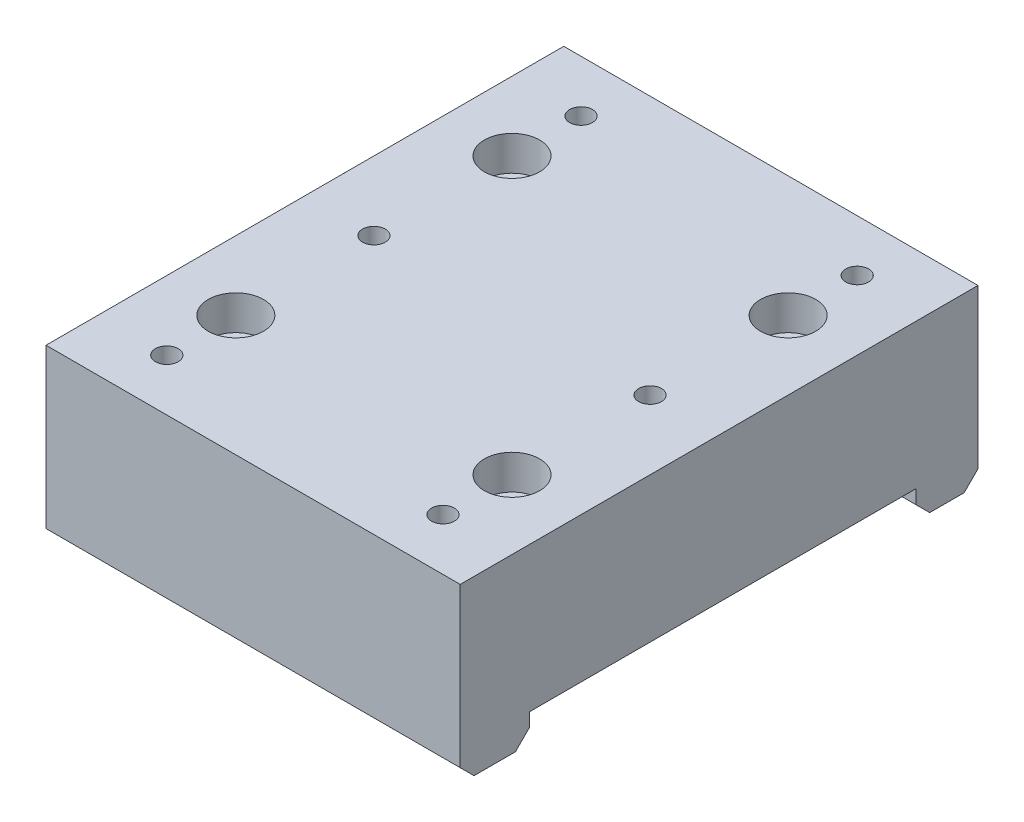
ISO-10303-21;
HEADER;
FILE_DESCRIPTION(('STEP AP214'),'2;1');
FILE_NAME('part.step','',(''),(''),'','','');
FILE_SCHEMA(('AUTOMOTIVE_DESIGN { 1 0 10303 214 1 1 1 1 }'));
ENDSEC;
DATA;
#1=APPLICATION_CONTEXT('core data for automotive mechanical design processes');
#2=APPLICATION_PROTOCOL_DEFINITION('international standard','automotive_design',2000,#1);
#3=PRODUCT_CONTEXT('',#1,'mechanical');
#4=PRODUCT('Part','Part','',(#3));
#5=PRODUCT_RELATED_PRODUCT_CATEGORY('part','',(#4));
#6=PRODUCT_DEFINITION_FORMATION('','',#4);
#7=PRODUCT_DEFINITION_CONTEXT('part definition',#1,'design');
#8=PRODUCT_DEFINITION('design','',#6,#7);
#9=PRODUCT_DEFINITION_SHAPE('','',#8);
#10=(LENGTH_UNIT() NAMED_UNIT(*) SI_UNIT(.MILLI.,.METRE.));
#11=(NAMED_UNIT(*) PLANE_ANGLE_UNIT() SI_UNIT($,.RADIAN.));
#12=(NAMED_UNIT(*) SI_UNIT($,.STERADIAN.) SOLID_ANGLE_UNIT());
#13=UNCERTAINTY_MEASURE_WITH_UNIT(LENGTH_MEASURE(1.E-05),#10,'distance_accuracy_value','');
#14=(GEOMETRIC_REPRESENTATION_CONTEXT(3) GLOBAL_UNCERTAINTY_ASSIGNED_CONTEXT((#13)) GLOBAL_UNIT_ASSIGNED_CONTEXT((#10,
#11,#12)) REPRESENTATION_CONTEXT('',''));
#15=CARTESIAN_POINT('',(0.,0.,0.));
#16=DIRECTION('',(0.,0.,1.));
#17=DIRECTION('',(1.,0.,0.));
#18=AXIS2_PLACEMENT_3D('',#15,#16,#17);
#19=CARTESIAN_POINT('',(0.,0.,0.));
#20=DIRECTION('',(0.,-1.,0.));
#21=DIRECTION('',(0.,0.,-1.));
#22=AXIS2_PLACEMENT_3D('',#19,#20,#21);
#23=PLANE('',#22);
#24=DIRECTION('',(0.,0.,-1.));
#25=VECTOR('',#24,1.);
#26=CARTESIAN_POINT('',(60.,0.,0.));
#27=LINE('',#26,#25);
#28=CARTESIAN_POINT('',(60.,0.,-2.00000000000003));
#29=VERTEX_POINT('',#28);
#30=CARTESIAN_POINT('',(60.,0.,-8.));
#31=VERTEX_POINT('',#30);
#32=EDGE_CURVE('E269',#29,#31,#27,.T.);
#33=ORIENTED_EDGE('',*,*,#32,.F.);
#34=DIRECTION('',(-1.,0.,0.));
#35=VECTOR('',#34,1.);
#36=CARTESIAN_POINT('',(0.,0.,-2.00000000000003));
#37=LINE('',#36,#35);
#38=CARTESIAN_POINT('',(0.,0.,-2.00000000000003));
#39=VERTEX_POINT('',#38);
#40=EDGE_CURVE('E62',#29,#39,#37,.T.);
#41=ORIENTED_EDGE('',*,*,#40,.T.);
#42=DIRECTION('',(0.,0.,1.));
#43=VECTOR('',#42,1.);
#44=CARTESIAN_POINT('',(0.,0.,0.));
#45=LINE('',#44,#43);
#46=CARTESIAN_POINT('',(0.,0.,-8.));
#47=VERTEX_POINT('',#46);
#48=EDGE_CURVE('E262',#47,#39,#45,.T.);
#49=ORIENTED_EDGE('',*,*,#48,.F.);
#50=DIRECTION('',(1.,0.,0.));
#51=VECTOR('',#50,1.);
#52=CARTESIAN_POINT('',(60.,0.,-8.));
#53=LINE('',#52,#51);
#54=EDGE_CURVE('E318',#47,#31,#53,.T.);
#55=ORIENTED_EDGE('',*,*,#54,.T.);
#56=EDGE_LOOP('',(#33,#41,#49,#55));
#57=FACE_BOUND('',#56,.T.);
#58=ADVANCED_FACE('F52',(#57),#23,.T.);
#59=CARTESIAN_POINT('',(0.,25.,0.));
#60=DIRECTION('',(1.,0.,0.));
#61=DIRECTION('',(0.,0.,-1.));
#62=AXIS2_PLACEMENT_3D('',#59,#60,#61);
#63=PLANE('',#62);
#64=DIRECTION('',(0.,-1.,0.));
#65=VECTOR('',#64,1.);
#66=CARTESIAN_POINT('',(0.,25.,-75.));
#67=LINE('',#66,#65);
#68=CARTESIAN_POINT('',(0.,25.,-75.));
#69=VERTEX_POINT('',#68);
#70=CARTESIAN_POINT('',(0.,2.00000000000002,-75.));
#71=VERTEX_POINT('',#70);
#72=EDGE_CURVE('E275',#69,#71,#67,.T.);
#73=ORIENTED_EDGE('',*,*,#72,.T.);
#74=DIRECTION('',(0.,-0.707106781186545,0.70710678118655));
#75=VECTOR('',#74,1.);
#76=CARTESIAN_POINT('',(0.,2.00000000000002,-75.));
#77=LINE('',#76,#75);
#78=CARTESIAN_POINT('',(0.,0.,-73.));
#79=VERTEX_POINT('',#78);
#80=EDGE_CURVE('E302',#71,#79,#77,.T.);
#81=ORIENTED_EDGE('',*,*,#80,.T.);
#82=CARTESIAN_POINT('',(0.,0.,-68.));
#83=VERTEX_POINT('',#82);
#84=EDGE_CURVE('E276',#79,#83,#45,.T.);
#85=ORIENTED_EDGE('',*,*,#84,.T.);
#86=DIRECTION('',(0.,0.707106781186545,0.70710678118655));
#87=VECTOR('',#86,1.);
#88=CARTESIAN_POINT('',(0.,2.00000000000002,-66.));
#89=LINE('',#88,#87);
#90=CARTESIAN_POINT('',(0.,2.00000000000002,-66.));
#91=VERTEX_POINT('',#90);
#92=EDGE_CURVE('E300',#83,#91,#89,.T.);
#93=ORIENTED_EDGE('',*,*,#92,.T.);
#94=DIRECTION('',(0.,1.,0.));
#95=VECTOR('',#94,1.);
#96=CARTESIAN_POINT('',(0.,0.,-66.));
#97=LINE('',#96,#95);
#98=CARTESIAN_POINT('',(0.,4.,-66.));
#99=VERTEX_POINT('',#98);
#100=EDGE_CURVE('E247',#91,#99,#97,.T.);
#101=ORIENTED_EDGE('',*,*,#100,.T.);
#102=DIRECTION('',(0.,0.,1.));
#103=VECTOR('',#102,1.);
#104=CARTESIAN_POINT('',(0.,4.,-10.));
#105=LINE('',#104,#103);
#106=CARTESIAN_POINT('',(0.,4.,-10.));
#107=VERTEX_POINT('',#106);
#108=EDGE_CURVE('E250',#99,#107,#105,.T.);
#109=ORIENTED_EDGE('',*,*,#108,.T.);
#110=DIRECTION('',(0.,-1.,0.));
#111=VECTOR('',#110,1.);
#112=CARTESIAN_POINT('',(0.,0.,-10.));
#113=LINE('',#112,#111);
#114=CARTESIAN_POINT('',(0.,2.00000000000002,-10.));
#115=VERTEX_POINT('',#114);
#116=EDGE_CURVE('E244',#107,#115,#113,.T.);
#117=ORIENTED_EDGE('',*,*,#116,.T.);
#118=DIRECTION('',(0.,-0.70710678118655,0.707106781186545));
#119=VECTOR('',#118,1.);
#120=CARTESIAN_POINT('',(0.,0.,-8.));
#121=LINE('',#120,#119);
#122=EDGE_CURVE('E296',#115,#47,#121,.T.);
#123=ORIENTED_EDGE('',*,*,#122,.T.);
#124=ORIENTED_EDGE('',*,*,#48,.T.);
#125=DIRECTION('',(0.,0.707106781186545,0.70710678118655));
#126=VECTOR('',#125,1.);
#127=CARTESIAN_POINT('',(0.,2.00000000000002,0.));
#128=LINE('',#127,#126);
#129=CARTESIAN_POINT('',(0.,2.00000000000002,0.));
#130=VERTEX_POINT('',#129);
#131=EDGE_CURVE('E298',#39,#130,#128,.T.);
#132=ORIENTED_EDGE('',*,*,#131,.T.);
#133=DIRECTION('',(0.,-1.,0.));
#134=VECTOR('',#133,1.);
#135=CARTESIAN_POINT('',(0.,25.,0.));
#136=LINE('',#135,#134);
#137=CARTESIAN_POINT('',(0.,25.,0.));
#138=VERTEX_POINT('',#137);
#139=EDGE_CURVE('E290',#138,#130,#136,.T.);
#140=ORIENTED_EDGE('',*,*,#139,.F.);
#141=DIRECTION('',(0.,0.,1.));
#142=VECTOR('',#141,1.);
#143=CARTESIAN_POINT('',(0.,25.,0.));
#144=LINE('',#143,#142);
#145=EDGE_CURVE('E265',#69,#138,#144,.T.);
#146=ORIENTED_EDGE('',*,*,#145,.F.);
#147=EDGE_LOOP('',(#73,#81,#85,#93,#101,#109,#117,#123,#124,#132,#140,#146));
#148=FACE_BOUND('',#147,.T.);
#149=ADVANCED_FACE('F354',(#148),#63,.F.);
#150=CARTESIAN_POINT('',(0.,25.,0.));
#151=DIRECTION('',(0.,0.,-1.));
#152=DIRECTION('',(-1.,0.,0.));
#153=AXIS2_PLACEMENT_3D('',#150,#151,#152);
#154=PLANE('',#153);
#155=ORIENTED_EDGE('',*,*,#139,.T.);
#156=DIRECTION('',(1.,0.,0.));
#157=VECTOR('',#156,1.);
#158=CARTESIAN_POINT('',(60.,2.00000000000002,0.));
#159=LINE('',#158,#157);
#160=CARTESIAN_POINT('',(60.,2.00000000000002,0.));
#161=VERTEX_POINT('',#160);
#162=EDGE_CURVE('E316',#130,#161,#159,.T.);
#163=ORIENTED_EDGE('',*,*,#162,.T.);
#164=DIRECTION('',(0.,-1.,0.));
#165=VECTOR('',#164,1.);
#166=CARTESIAN_POINT('',(60.,25.,0.));
#167=LINE('',#166,#165);
#168=CARTESIAN_POINT('',(60.,25.,0.));
#169=VERTEX_POINT('',#168);
#170=EDGE_CURVE('E287',#169,#161,#167,.T.);
#171=ORIENTED_EDGE('',*,*,#170,.F.);
#172=DIRECTION('',(1.,0.,0.));
#173=VECTOR('',#172,1.);
#174=CARTESIAN_POINT('',(0.,25.,0.));
#175=LINE('',#174,#173);
#176=EDGE_CURVE('E268',#138,#169,#175,.T.);
#177=ORIENTED_EDGE('',*,*,#176,.F.);
#178=EDGE_LOOP('',(#155,#163,#171,#177));
#179=FACE_BOUND('',#178,.T.);
#180=ADVANCED_FACE('F361',(#179),#154,.F.);
#181=CARTESIAN_POINT('',(60.,25.,0.));
#182=DIRECTION('',(-1.,0.,0.));
#183=DIRECTION('',(0.,0.,1.));
#184=AXIS2_PLACEMENT_3D('',#181,#182,#183);
#185=PLANE('',#184);
#186=CARTESIAN_POINT('',(60.,0.,-68.));
#187=VERTEX_POINT('',#186);
#188=CARTESIAN_POINT('',(60.,0.,-73.));
#189=VERTEX_POINT('',#188);
#190=EDGE_CURVE('E279',#187,#189,#27,.T.);
#191=ORIENTED_EDGE('',*,*,#190,.T.);
#192=DIRECTION('',(0.,0.707106781186545,-0.70710678118655));
#193=VECTOR('',#192,1.);
#194=CARTESIAN_POINT('',(60.,2.00000000000002,-75.));
#195=LINE('',#194,#193);
#196=CARTESIAN_POINT('',(60.,2.00000000000002,-75.));
#197=VERTEX_POINT('',#196);
#198=EDGE_CURVE('E312',#189,#197,#195,.T.);
#199=ORIENTED_EDGE('',*,*,#198,.T.);
#200=DIRECTION('',(0.,-1.,0.));
#201=VECTOR('',#200,1.);
#202=CARTESIAN_POINT('',(60.,25.,-75.));
#203=LINE('',#202,#201);
#204=CARTESIAN_POINT('',(60.,25.,-75.));
#205=VERTEX_POINT('',#204);
#206=EDGE_CURVE('E284',#205,#197,#203,.T.);
#207=ORIENTED_EDGE('',*,*,#206,.F.);
#208=DIRECTION('',(0.,0.,-1.));
#209=VECTOR('',#208,1.);
#210=CARTESIAN_POINT('',(60.,25.,0.));
#211=LINE('',#210,#209);
#212=EDGE_CURVE('E271',#169,#205,#211,.T.);
#213=ORIENTED_EDGE('',*,*,#212,.F.);
#214=ORIENTED_EDGE('',*,*,#170,.T.);
#215=DIRECTION('',(0.,-0.707106781186545,-0.70710678118655));
#216=VECTOR('',#215,1.);
#217=CARTESIAN_POINT('',(60.,2.00000000000002,0.));
#218=LINE('',#217,#216);
#219=EDGE_CURVE('E70',#161,#29,#218,.T.);
#220=ORIENTED_EDGE('',*,*,#219,.T.);
#221=ORIENTED_EDGE('',*,*,#32,.T.);
#222=DIRECTION('',(0.,0.70710678118655,-0.707106781186545));
#223=VECTOR('',#222,1.);
#224=CARTESIAN_POINT('',(60.,0.,-8.));
#225=LINE('',#224,#223);
#226=CARTESIAN_POINT('',(60.,2.00000000000002,-10.));
#227=VERTEX_POINT('',#226);
#228=EDGE_CURVE('E308',#31,#227,#225,.T.);
#229=ORIENTED_EDGE('',*,*,#228,.T.);
#230=DIRECTION('',(0.,-1.,0.));
#231=VECTOR('',#230,1.);
#232=CARTESIAN_POINT('',(60.,0.,-10.));
#233=LINE('',#232,#231);
#234=CARTESIAN_POINT('',(60.,4.,-10.));
#235=VERTEX_POINT('',#234);
#236=EDGE_CURVE('E241',#235,#227,#233,.T.);
#237=ORIENTED_EDGE('',*,*,#236,.F.);
#238=DIRECTION('',(0.,0.,1.));
#239=VECTOR('',#238,1.);
#240=CARTESIAN_POINT('',(60.,4.,-10.));
#241=LINE('',#240,#239);
#242=CARTESIAN_POINT('',(60.,4.,-66.));
#243=VERTEX_POINT('',#242);
#244=EDGE_CURVE('E248',#243,#235,#241,.T.);
#245=ORIENTED_EDGE('',*,*,#244,.F.);
#246=DIRECTION('',(0.,1.,0.));
#247=VECTOR('',#246,1.);
#248=CARTESIAN_POINT('',(60.,0.,-66.));
#249=LINE('',#248,#247);
#250=CARTESIAN_POINT('',(60.,2.00000000000002,-66.));
#251=VERTEX_POINT('',#250);
#252=EDGE_CURVE('E256',#251,#243,#249,.T.);
#253=ORIENTED_EDGE('',*,*,#252,.F.);
#254=DIRECTION('',(0.,-0.707106781186545,-0.70710678118655));
#255=VECTOR('',#254,1.);
#256=CARTESIAN_POINT('',(60.,2.00000000000002,-66.));
#257=LINE('',#256,#255);
#258=EDGE_CURVE('E78',#251,#187,#257,.T.);
#259=ORIENTED_EDGE('',*,*,#258,.T.);
#260=EDGE_LOOP('',(#191,#199,#207,#213,#214,#220,#221,#229,#237,#245,#253,#259));
#261=FACE_BOUND('',#260,.T.);
#262=ADVANCED_FACE('F391',(#261),#185,.F.);
#263=CARTESIAN_POINT('',(0.,25.,-75.));
#264=DIRECTION('',(0.,0.,1.));
#265=DIRECTION('',(1.,0.,0.));
#266=AXIS2_PLACEMENT_3D('',#263,#264,#265);
#267=PLANE('',#266);
#268=ORIENTED_EDGE('',*,*,#206,.T.);
#269=DIRECTION('',(-1.,0.,0.));
#270=VECTOR('',#269,1.);
#271=CARTESIAN_POINT('',(0.,2.00000000000002,-75.));
#272=LINE('',#271,#270);
#273=EDGE_CURVE('E293',#197,#71,#272,.T.);
#274=ORIENTED_EDGE('',*,*,#273,.T.);
#275=ORIENTED_EDGE('',*,*,#72,.F.);
#276=DIRECTION('',(-1.,0.,0.));
#277=VECTOR('',#276,1.);
#278=CARTESIAN_POINT('',(0.,25.,-75.));
#279=LINE('',#278,#277);
#280=EDGE_CURVE('E273',#205,#69,#279,.T.);
#281=ORIENTED_EDGE('',*,*,#280,.F.);
#282=EDGE_LOOP('',(#268,#274,#275,#281));
#283=FACE_BOUND('',#282,.T.);
#284=ADVANCED_FACE('F378',(#283),#267,.F.);
#285=CARTESIAN_POINT('',(0.,25.,0.));
#286=DIRECTION('',(0.,-1.,0.));
#287=DIRECTION('',(0.,0.,-1.));
#288=AXIS2_PLACEMENT_3D('',#285,#286,#287);
#289=PLANE('',#288);
#290=CARTESIAN_POINT('',(10.,25.,-67.5));
#291=DIRECTION('',(0.,1.,0.));
#292=DIRECTION('',(0.,0.,1.));
#293=AXIS2_PLACEMENT_3D('',#290,#291,#292);
#294=CIRCLE('',#293,1.65);
#295=CARTESIAN_POINT('',(10.,25.,-65.85));
#296=VERTEX_POINT('',#295);
#297=EDGE_CURVE('E172',#296,#296,#294,.T.);
#298=ORIENTED_EDGE('',*,*,#297,.F.);
#299=EDGE_LOOP('',(#298));
#300=FACE_BOUND('',#299,.T.);
#301=CARTESIAN_POINT('',(10.,25.,-37.5));
#302=DIRECTION('',(0.,1.,0.));
#303=DIRECTION('',(0.,0.,1.));
#304=AXIS2_PLACEMENT_3D('',#301,#302,#303);
#305=CIRCLE('',#304,1.65);
#306=CARTESIAN_POINT('',(10.,25.,-35.85));
#307=VERTEX_POINT('',#306);
#308=EDGE_CURVE('E171',#307,#307,#305,.T.);
#309=ORIENTED_EDGE('',*,*,#308,.F.);
#310=EDGE_LOOP('',(#309));
#311=FACE_BOUND('',#310,.T.);
#312=CARTESIAN_POINT('',(10.,25.,-7.5));
#313=DIRECTION('',(0.,1.,0.));
#314=DIRECTION('',(0.,0.,1.));
#315=AXIS2_PLACEMENT_3D('',#312,#313,#314);
#316=CIRCLE('',#315,1.65);
#317=CARTESIAN_POINT('',(10.,25.,-5.85));
#318=VERTEX_POINT('',#317);
#319=EDGE_CURVE('E182',#318,#318,#316,.T.);
#320=ORIENTED_EDGE('',*,*,#319,.F.);
#321=EDGE_LOOP('',(#320));
#322=FACE_BOUND('',#321,.T.);
#323=CARTESIAN_POINT('',(50.,25.,-67.5));
#324=DIRECTION('',(0.,1.,0.));
#325=DIRECTION('',(0.,0.,1.));
#326=AXIS2_PLACEMENT_3D('',#323,#324,#325);
#327=CIRCLE('',#326,1.65);
#328=CARTESIAN_POINT('',(50.,25.,-65.85));
#329=VERTEX_POINT('',#328);
#330=EDGE_CURVE('E188',#329,#329,#327,.T.);
#331=ORIENTED_EDGE('',*,*,#330,.F.);
#332=EDGE_LOOP('',(#331));
#333=FACE_BOUND('',#332,.T.);
#334=CARTESIAN_POINT('',(50.,25.,-37.5));
#335=DIRECTION('',(0.,1.,0.));
#336=DIRECTION('',(0.,0.,1.));
#337=AXIS2_PLACEMENT_3D('',#334,#335,#336);
#338=CIRCLE('',#337,1.65);
#339=CARTESIAN_POINT('',(50.,25.,-35.85));
#340=VERTEX_POINT('',#339);
#341=EDGE_CURVE('E194',#340,#340,#338,.T.);
#342=ORIENTED_EDGE('',*,*,#341,.F.);
#343=EDGE_LOOP('',(#342));
#344=FACE_BOUND('',#343,.T.);
#345=CARTESIAN_POINT('',(50.,25.,-7.5));
#346=DIRECTION('',(0.,1.,0.));
#347=DIRECTION('',(0.,0.,1.));
#348=AXIS2_PLACEMENT_3D('',#345,#346,#347);
#349=CIRCLE('',#348,1.65);
#350=CARTESIAN_POINT('',(50.,25.,-5.85));
#351=VERTEX_POINT('',#350);
#352=EDGE_CURVE('E200',#351,#351,#349,.T.);
#353=ORIENTED_EDGE('',*,*,#352,.F.);
#354=EDGE_LOOP('',(#353));
#355=FACE_BOUND('',#354,.T.);
#356=CARTESIAN_POINT('',(10.,25.,-17.5));
#357=DIRECTION('',(0.,1.,0.));
#358=DIRECTION('',(0.,0.,1.));
#359=AXIS2_PLACEMENT_3D('',#356,#357,#358);
#360=CIRCLE('',#359,4.);
#361=CARTESIAN_POINT('',(10.,25.,-13.5));
#362=VERTEX_POINT('',#361);
#363=EDGE_CURVE('E226',#362,#362,#360,.T.);
#364=ORIENTED_EDGE('',*,*,#363,.F.);
#365=EDGE_LOOP('',(#364));
#366=FACE_BOUND('',#365,.T.);
#367=CARTESIAN_POINT('',(50.,25.,-57.5));
#368=DIRECTION('',(0.,1.,0.));
#369=DIRECTION('',(0.,0.,1.));
#370=AXIS2_PLACEMENT_3D('',#367,#368,#369);
#371=CIRCLE('',#370,4.00000000000001);
#372=CARTESIAN_POINT('',(50.,25.,-53.5));
#373=VERTEX_POINT('',#372);
#374=EDGE_CURVE('E233',#373,#373,#371,.T.);
#375=ORIENTED_EDGE('',*,*,#374,.F.);
#376=EDGE_LOOP('',(#375));
#377=FACE_BOUND('',#376,.T.);
#378=CARTESIAN_POINT('',(50.,25.,-17.5));
#379=DIRECTION('',(0.,1.,0.));
#380=DIRECTION('',(0.,0.,1.));
#381=AXIS2_PLACEMENT_3D('',#378,#379,#380);
#382=CIRCLE('',#381,4.00000000000001);
#383=CARTESIAN_POINT('',(50.,25.,-13.5));
#384=VERTEX_POINT('',#383);
#385=EDGE_CURVE('E219',#384,#384,#382,.T.);
#386=ORIENTED_EDGE('',*,*,#385,.F.);
#387=EDGE_LOOP('',(#386));
#388=FACE_BOUND('',#387,.T.);
#389=CARTESIAN_POINT('',(10.,25.,-57.5));
#390=DIRECTION('',(0.,1.,0.));
#391=DIRECTION('',(0.,0.,1.));
#392=AXIS2_PLACEMENT_3D('',#389,#390,#391);
#393=CIRCLE('',#392,4.);
#394=CARTESIAN_POINT('',(10.,25.,-53.5));
#395=VERTEX_POINT('',#394);
#396=EDGE_CURVE('E229',#395,#395,#393,.T.);
#397=ORIENTED_EDGE('',*,*,#396,.F.);
#398=EDGE_LOOP('',(#397));
#399=FACE_BOUND('',#398,.T.);
#400=ORIENTED_EDGE('',*,*,#145,.T.);
#401=ORIENTED_EDGE('',*,*,#176,.T.);
#402=ORIENTED_EDGE('',*,*,#212,.T.);
#403=ORIENTED_EDGE('',*,*,#280,.T.);
#404=EDGE_LOOP('',(#400,#401,#402,#403));
#405=FACE_BOUND('',#404,.T.);
#406=ADVANCED_FACE('F369',(#300,#311,#322,#333,#344,#355,#366,#377,#388,#399,#405),#289,.F.);
#407=ORIENTED_EDGE('',*,*,#84,.F.);
#408=DIRECTION('',(1.,0.,0.));
#409=VECTOR('',#408,1.);
#410=CARTESIAN_POINT('',(60.,0.,-73.));
#411=LINE('',#410,#409);
#412=EDGE_CURVE('E306',#79,#189,#411,.T.);
#413=ORIENTED_EDGE('',*,*,#412,.T.);
#414=ORIENTED_EDGE('',*,*,#190,.F.);
#415=DIRECTION('',(-1.,0.,0.));
#416=VECTOR('',#415,1.);
#417=CARTESIAN_POINT('',(0.,0.,-68.));
#418=LINE('',#417,#416);
#419=EDGE_CURVE('E304',#187,#83,#418,.T.);
#420=ORIENTED_EDGE('',*,*,#419,.T.);
#421=EDGE_LOOP('',(#407,#413,#414,#420));
#422=FACE_BOUND('',#421,.T.);
#423=ADVANCED_FACE('F357',(#422),#23,.T.);
#424=CARTESIAN_POINT('',(0.,0.,-10.));
#425=DIRECTION('',(0.,0.,1.));
#426=DIRECTION('',(1.,0.,0.));
#427=AXIS2_PLACEMENT_3D('',#424,#425,#426);
#428=PLANE('',#427);
#429=ORIENTED_EDGE('',*,*,#236,.T.);
#430=DIRECTION('',(-1.,0.,0.));
#431=VECTOR('',#430,1.);
#432=CARTESIAN_POINT('',(0.,2.00000000000002,-10.));
#433=LINE('',#432,#431);
#434=EDGE_CURVE('E11',#227,#115,#433,.T.);
#435=ORIENTED_EDGE('',*,*,#434,.T.);
#436=ORIENTED_EDGE('',*,*,#116,.F.);
#437=DIRECTION('',(1.,0.,0.));
#438=VECTOR('',#437,1.);
#439=CARTESIAN_POINT('',(0.,4.,-10.));
#440=LINE('',#439,#438);
#441=EDGE_CURVE('E260',#107,#235,#440,.T.);
#442=ORIENTED_EDGE('',*,*,#441,.T.);
#443=EDGE_LOOP('',(#429,#435,#436,#442));
#444=FACE_BOUND('',#443,.T.);
#445=ADVANCED_FACE('F368',(#444),#428,.F.);
#446=CARTESIAN_POINT('',(0.,4.,-10.));
#447=DIRECTION('',(0.,1.,0.));
#448=DIRECTION('',(0.,0.,1.));
#449=AXIS2_PLACEMENT_3D('',#446,#447,#448);
#450=PLANE('',#449);
#451=CARTESIAN_POINT('',(10.,4.,-17.5));
#452=DIRECTION('',(0.,1.,0.));
#453=DIRECTION('',(0.,0.,1.));
#454=AXIS2_PLACEMENT_3D('',#451,#452,#453);
#455=CIRCLE('',#454,2.5);
#456=CARTESIAN_POINT('',(10.,4.,-15.));
#457=VERTEX_POINT('',#456);
#458=EDGE_CURVE('E57',#457,#457,#455,.T.);
#459=ORIENTED_EDGE('',*,*,#458,.T.);
#460=EDGE_LOOP('',(#459));
#461=FACE_BOUND('',#460,.T.);
#462=CARTESIAN_POINT('',(50.,4.,-17.5));
#463=DIRECTION('',(0.,1.,0.));
#464=DIRECTION('',(0.,0.,1.));
#465=AXIS2_PLACEMENT_3D('',#462,#463,#464);
#466=CIRCLE('',#465,2.5);
#467=CARTESIAN_POINT('',(50.,4.,-15.));
#468=VERTEX_POINT('',#467);
#469=EDGE_CURVE('E326',#468,#468,#466,.T.);
#470=ORIENTED_EDGE('',*,*,#469,.T.);
#471=EDGE_LOOP('',(#470));
#472=FACE_BOUND('',#471,.T.);
#473=CARTESIAN_POINT('',(50.,4.,-57.5));
#474=DIRECTION('',(0.,1.,0.));
#475=DIRECTION('',(0.,0.,1.));
#476=AXIS2_PLACEMENT_3D('',#473,#474,#475);
#477=CIRCLE('',#476,2.5);
#478=CARTESIAN_POINT('',(50.,4.,-55.));
#479=VERTEX_POINT('',#478);
#480=EDGE_CURVE('E324',#479,#479,#477,.T.);
#481=ORIENTED_EDGE('',*,*,#480,.T.);
#482=EDGE_LOOP('',(#481));
#483=FACE_BOUND('',#482,.T.);
#484=CARTESIAN_POINT('',(10.,4.,-57.5));
#485=DIRECTION('',(0.,1.,0.));
#486=DIRECTION('',(0.,0.,1.));
#487=AXIS2_PLACEMENT_3D('',#484,#485,#486);
#488=CIRCLE('',#487,2.5);
#489=CARTESIAN_POINT('',(10.,4.,-55.));
#490=VERTEX_POINT('',#489);
#491=EDGE_CURVE('E218',#490,#490,#488,.T.);
#492=ORIENTED_EDGE('',*,*,#491,.T.);
#493=EDGE_LOOP('',(#492));
#494=FACE_BOUND('',#493,.T.);
#495=ORIENTED_EDGE('',*,*,#244,.T.);
#496=ORIENTED_EDGE('',*,*,#441,.F.);
#497=ORIENTED_EDGE('',*,*,#108,.F.);
#498=DIRECTION('',(1.,0.,0.));
#499=VECTOR('',#498,1.);
#500=CARTESIAN_POINT('',(0.,4.,-66.));
#501=LINE('',#500,#499);
#502=EDGE_CURVE('E253',#99,#243,#501,.T.);
#503=ORIENTED_EDGE('',*,*,#502,.T.);
#504=EDGE_LOOP('',(#495,#496,#497,#503));
#505=FACE_BOUND('',#504,.T.);
#506=ADVANCED_FACE('F333',(#461,#472,#483,#494,#505),#450,.F.);
#507=CARTESIAN_POINT('',(0.,0.,-66.));
#508=DIRECTION('',(0.,0.,-1.));
#509=DIRECTION('',(-1.,0.,0.));
#510=AXIS2_PLACEMENT_3D('',#507,#508,#509);
#511=PLANE('',#510);
#512=ORIENTED_EDGE('',*,*,#100,.F.);
#513=DIRECTION('',(1.,0.,0.));
#514=VECTOR('',#513,1.);
#515=CARTESIAN_POINT('',(60.,2.00000000000002,-66.));
#516=LINE('',#515,#514);
#517=EDGE_CURVE('E314',#91,#251,#516,.T.);
#518=ORIENTED_EDGE('',*,*,#517,.T.);
#519=ORIENTED_EDGE('',*,*,#252,.T.);
#520=ORIENTED_EDGE('',*,*,#502,.F.);
#521=EDGE_LOOP('',(#512,#518,#519,#520));
#522=FACE_BOUND('',#521,.T.);
#523=ADVANCED_FACE('F418',(#522),#511,.F.);
#524=CARTESIAN_POINT('',(0.,2.00000000000002,-75.));
#525=DIRECTION('',(0.,-0.70710678118655,-0.707106781186545));
#526=DIRECTION('',(1.,0.,0.));
#527=AXIS2_PLACEMENT_3D('',#524,#525,#526);
#528=PLANE('',#527);
#529=ORIENTED_EDGE('',*,*,#198,.F.);
#530=ORIENTED_EDGE('',*,*,#412,.F.);
#531=ORIENTED_EDGE('',*,*,#80,.F.);
#532=ORIENTED_EDGE('',*,*,#273,.F.);
#533=EDGE_LOOP('',(#529,#530,#531,#532));
#534=FACE_BOUND('',#533,.T.);
#535=ADVANCED_FACE('F387',(#534),#528,.T.);
#536=CARTESIAN_POINT('',(0.,2.00000000000002,-66.));
#537=DIRECTION('',(0.,-0.70710678118655,0.707106781186545));
#538=DIRECTION('',(-1.,0.,0.));
#539=AXIS2_PLACEMENT_3D('',#536,#537,#538);
#540=PLANE('',#539);
#541=ORIENTED_EDGE('',*,*,#92,.F.);
#542=ORIENTED_EDGE('',*,*,#419,.F.);
#543=ORIENTED_EDGE('',*,*,#258,.F.);
#544=ORIENTED_EDGE('',*,*,#517,.F.);
#545=EDGE_LOOP('',(#541,#542,#543,#544));
#546=FACE_BOUND('',#545,.T.);
#547=ADVANCED_FACE('F419',(#546),#540,.T.);
#548=CARTESIAN_POINT('',(0.,2.00000000000002,0.));
#549=DIRECTION('',(0.,-0.70710678118655,0.707106781186545));
#550=DIRECTION('',(-1.,0.,0.));
#551=AXIS2_PLACEMENT_3D('',#548,#549,#550);
#552=PLANE('',#551);
#553=ORIENTED_EDGE('',*,*,#131,.F.);
#554=ORIENTED_EDGE('',*,*,#40,.F.);
#555=ORIENTED_EDGE('',*,*,#219,.F.);
#556=ORIENTED_EDGE('',*,*,#162,.F.);
#557=EDGE_LOOP('',(#553,#554,#555,#556));
#558=FACE_BOUND('',#557,.T.);
#559=ADVANCED_FACE('F402',(#558),#552,.T.);
#560=CARTESIAN_POINT('',(0.,0.,-8.));
#561=DIRECTION('',(0.,-0.707106781186545,-0.70710678118655));
#562=DIRECTION('',(-1.,0.,0.));
#563=AXIS2_PLACEMENT_3D('',#560,#561,#562);
#564=PLANE('',#563);
#565=ORIENTED_EDGE('',*,*,#122,.F.);
#566=ORIENTED_EDGE('',*,*,#434,.F.);
#567=ORIENTED_EDGE('',*,*,#228,.F.);
#568=ORIENTED_EDGE('',*,*,#54,.F.);
#569=EDGE_LOOP('',(#565,#566,#567,#568));
#570=FACE_BOUND('',#569,.T.);
#571=ADVANCED_FACE('F55',(#570),#564,.T.);
#572=CARTESIAN_POINT('',(10.,20.,-57.5));
#573=DIRECTION('',(0.,1.,0.));
#574=DIRECTION('',(0.,0.,1.));
#575=AXIS2_PLACEMENT_3D('',#572,#573,#574);
#576=CYLINDRICAL_SURFACE('',#575,4.);
#577=CARTESIAN_POINT('',(10.,20.,-57.5));
#578=DIRECTION('',(0.,1.,0.));
#579=DIRECTION('',(0.,0.,1.));
#580=AXIS2_PLACEMENT_3D('',#577,#578,#579);
#581=CIRCLE('',#580,4.);
#582=CARTESIAN_POINT('',(10.,20.,-53.5));
#583=VERTEX_POINT('',#582);
#584=EDGE_CURVE('E238',#583,#583,#581,.T.);
#585=ORIENTED_EDGE('',*,*,#584,.F.);
#586=EDGE_LOOP('',(#585));
#587=FACE_BOUND('',#586,.T.);
#588=ORIENTED_EDGE('',*,*,#396,.T.);
#589=EDGE_LOOP('',(#588));
#590=FACE_BOUND('',#589,.T.);
#591=ADVANCED_FACE('F518',(#587,#590),#576,.F.);
#592=CARTESIAN_POINT('',(10.,20.,-57.5));
#593=DIRECTION('',(0.,1.,0.));
#594=DIRECTION('',(0.,0.,1.));
#595=AXIS2_PLACEMENT_3D('',#592,#593,#594);
#596=PLANE('',#595);
#597=CARTESIAN_POINT('',(10.,20.,-57.5));
#598=DIRECTION('',(0.,1.,0.));
#599=DIRECTION('',(0.,0.,1.));
#600=AXIS2_PLACEMENT_3D('',#597,#598,#599);
#601=CIRCLE('',#600,2.5);
#602=CARTESIAN_POINT('',(10.,20.,-55.));
#603=VERTEX_POINT('',#602);
#604=EDGE_CURVE('E210',#603,#603,#601,.T.);
#605=ORIENTED_EDGE('',*,*,#604,.F.);
#606=EDGE_LOOP('',(#605));
#607=FACE_BOUND('',#606,.T.);
#608=ORIENTED_EDGE('',*,*,#584,.T.);
#609=EDGE_LOOP('',(#608));
#610=FACE_BOUND('',#609,.T.);
#611=ADVANCED_FACE('F525',(#607,#610),#596,.T.);
#612=CARTESIAN_POINT('',(50.,20.,-17.5));
#613=DIRECTION('',(0.,1.,0.));
#614=DIRECTION('',(0.,0.,1.));
#615=AXIS2_PLACEMENT_3D('',#612,#613,#614);
#616=CYLINDRICAL_SURFACE('',#615,4.00000000000001);
#617=CARTESIAN_POINT('',(50.,20.,-17.5));
#618=DIRECTION('',(0.,1.,0.));
#619=DIRECTION('',(0.,0.,1.));
#620=AXIS2_PLACEMENT_3D('',#617,#618,#619);
#621=CIRCLE('',#620,4.00000000000001);
#622=CARTESIAN_POINT('',(50.,20.,-13.5));
#623=VERTEX_POINT('',#622);
#624=EDGE_CURVE('E223',#623,#623,#621,.T.);
#625=ORIENTED_EDGE('',*,*,#624,.F.);
#626=EDGE_LOOP('',(#625));
#627=FACE_BOUND('',#626,.T.);
#628=ORIENTED_EDGE('',*,*,#385,.T.);
#629=EDGE_LOOP('',(#628));
#630=FACE_BOUND('',#629,.T.);
#631=ADVANCED_FACE('F534',(#627,#630),#616,.F.);
#632=CARTESIAN_POINT('',(50.,20.,-17.5));
#633=DIRECTION('',(0.,1.,0.));
#634=DIRECTION('',(0.,0.,1.));
#635=AXIS2_PLACEMENT_3D('',#632,#633,#634);
#636=PLANE('',#635);
#637=CARTESIAN_POINT('',(50.,20.,-17.5));
#638=DIRECTION('',(0.,1.,0.));
#639=DIRECTION('',(0.,0.,1.));
#640=AXIS2_PLACEMENT_3D('',#637,#638,#639);
#641=CIRCLE('',#640,2.5);
#642=CARTESIAN_POINT('',(50.,20.,-15.));
#643=VERTEX_POINT('',#642);
#644=EDGE_CURVE('E211',#643,#643,#641,.T.);
#645=ORIENTED_EDGE('',*,*,#644,.F.);
#646=EDGE_LOOP('',(#645));
#647=FACE_BOUND('',#646,.T.);
#648=ORIENTED_EDGE('',*,*,#624,.T.);
#649=EDGE_LOOP('',(#648));
#650=FACE_BOUND('',#649,.T.);
#651=ADVANCED_FACE('F543',(#647,#650),#636,.T.);
#652=CARTESIAN_POINT('',(50.,20.,-57.5));
#653=DIRECTION('',(0.,1.,0.));
#654=DIRECTION('',(0.,0.,1.));
#655=AXIS2_PLACEMENT_3D('',#652,#653,#654);
#656=CYLINDRICAL_SURFACE('',#655,4.00000000000001);
#657=CARTESIAN_POINT('',(50.,20.,-57.5));
#658=DIRECTION('',(0.,1.,0.));
#659=DIRECTION('',(0.,0.,1.));
#660=AXIS2_PLACEMENT_3D('',#657,#658,#659);
#661=CIRCLE('',#660,4.00000000000001);
#662=CARTESIAN_POINT('',(50.,20.,-53.5));
#663=VERTEX_POINT('',#662);
#664=EDGE_CURVE('E222',#663,#663,#661,.T.);
#665=ORIENTED_EDGE('',*,*,#664,.F.);
#666=EDGE_LOOP('',(#665));
#667=FACE_BOUND('',#666,.T.);
#668=ORIENTED_EDGE('',*,*,#374,.T.);
#669=EDGE_LOOP('',(#668));
#670=FACE_BOUND('',#669,.T.);
#671=ADVANCED_FACE('F552',(#667,#670),#656,.F.);
#672=CARTESIAN_POINT('',(50.,20.,-57.5));
#673=DIRECTION('',(0.,1.,0.));
#674=DIRECTION('',(0.,0.,1.));
#675=AXIS2_PLACEMENT_3D('',#672,#673,#674);
#676=PLANE('',#675);
#677=CARTESIAN_POINT('',(50.,20.,-57.5));
#678=DIRECTION('',(0.,1.,0.));
#679=DIRECTION('',(0.,0.,1.));
#680=AXIS2_PLACEMENT_3D('',#677,#678,#679);
#681=CIRCLE('',#680,2.5);
#682=CARTESIAN_POINT('',(50.,20.,-55.));
#683=VERTEX_POINT('',#682);
#684=EDGE_CURVE('E207',#683,#683,#681,.T.);
#685=ORIENTED_EDGE('',*,*,#684,.F.);
#686=EDGE_LOOP('',(#685));
#687=FACE_BOUND('',#686,.T.);
#688=ORIENTED_EDGE('',*,*,#664,.T.);
#689=EDGE_LOOP('',(#688));
#690=FACE_BOUND('',#689,.T.);
#691=ADVANCED_FACE('F561',(#687,#690),#676,.T.);
#692=CARTESIAN_POINT('',(10.,20.,-17.5));
#693=DIRECTION('',(0.,1.,0.));
#694=DIRECTION('',(0.,0.,1.));
#695=AXIS2_PLACEMENT_3D('',#692,#693,#694);
#696=CYLINDRICAL_SURFACE('',#695,4.);
#697=CARTESIAN_POINT('',(10.,20.,-17.5));
#698=DIRECTION('',(0.,1.,0.));
#699=DIRECTION('',(0.,0.,1.));
#700=AXIS2_PLACEMENT_3D('',#697,#698,#699);
#701=CIRCLE('',#700,4.);
#702=CARTESIAN_POINT('',(10.,20.,-13.5));
#703=VERTEX_POINT('',#702);
#704=EDGE_CURVE('E230',#703,#703,#701,.T.);
#705=ORIENTED_EDGE('',*,*,#704,.F.);
#706=EDGE_LOOP('',(#705));
#707=FACE_BOUND('',#706,.T.);
#708=ORIENTED_EDGE('',*,*,#363,.T.);
#709=EDGE_LOOP('',(#708));
#710=FACE_BOUND('',#709,.T.);
#711=ADVANCED_FACE('F570',(#707,#710),#696,.F.);
#712=CARTESIAN_POINT('',(10.,20.,-17.5));
#713=DIRECTION('',(0.,1.,0.));
#714=DIRECTION('',(0.,0.,1.));
#715=AXIS2_PLACEMENT_3D('',#712,#713,#714);
#716=PLANE('',#715);
#717=CARTESIAN_POINT('',(10.,20.,-17.5));
#718=DIRECTION('',(0.,1.,0.));
#719=DIRECTION('',(0.,0.,1.));
#720=AXIS2_PLACEMENT_3D('',#717,#718,#719);
#721=CIRCLE('',#720,2.5);
#722=CARTESIAN_POINT('',(10.,20.,-15.));
#723=VERTEX_POINT('',#722);
#724=EDGE_CURVE('E206',#723,#723,#721,.T.);
#725=ORIENTED_EDGE('',*,*,#724,.F.);
#726=EDGE_LOOP('',(#725));
#727=FACE_BOUND('',#726,.T.);
#728=ORIENTED_EDGE('',*,*,#704,.T.);
#729=EDGE_LOOP('',(#728));
#730=FACE_BOUND('',#729,.T.);
#731=ADVANCED_FACE('F579',(#727,#730),#716,.T.);
#732=CARTESIAN_POINT('',(10.,0.,-57.5));
#733=DIRECTION('',(0.,1.,0.));
#734=DIRECTION('',(0.,0.,1.));
#735=AXIS2_PLACEMENT_3D('',#732,#733,#734);
#736=CYLINDRICAL_SURFACE('',#735,2.5);
#737=ORIENTED_EDGE('',*,*,#604,.T.);
#738=EDGE_LOOP('',(#737));
#739=FACE_BOUND('',#738,.T.);
#740=ORIENTED_EDGE('',*,*,#491,.F.);
#741=EDGE_LOOP('',(#740));
#742=FACE_BOUND('',#741,.T.);
#743=ADVANCED_FACE('F588',(#739,#742),#736,.F.);
#744=CARTESIAN_POINT('',(50.,0.,-57.5));
#745=DIRECTION('',(0.,1.,0.));
#746=DIRECTION('',(0.,0.,1.));
#747=AXIS2_PLACEMENT_3D('',#744,#745,#746);
#748=CYLINDRICAL_SURFACE('',#747,2.5);
#749=ORIENTED_EDGE('',*,*,#684,.T.);
#750=EDGE_LOOP('',(#749));
#751=FACE_BOUND('',#750,.T.);
#752=ORIENTED_EDGE('',*,*,#480,.F.);
#753=EDGE_LOOP('',(#752));
#754=FACE_BOUND('',#753,.T.);
#755=ADVANCED_FACE('F349',(#751,#754),#748,.F.);
#756=CARTESIAN_POINT('',(50.,0.,-17.5));
#757=DIRECTION('',(0.,1.,0.));
#758=DIRECTION('',(0.,0.,1.));
#759=AXIS2_PLACEMENT_3D('',#756,#757,#758);
#760=CYLINDRICAL_SURFACE('',#759,2.5);
#761=ORIENTED_EDGE('',*,*,#644,.T.);
#762=EDGE_LOOP('',(#761));
#763=FACE_BOUND('',#762,.T.);
#764=ORIENTED_EDGE('',*,*,#469,.F.);
#765=EDGE_LOOP('',(#764));
#766=FACE_BOUND('',#765,.T.);
#767=ADVANCED_FACE('F338',(#763,#766),#760,.F.);
#768=CARTESIAN_POINT('',(10.,0.,-17.5));
#769=DIRECTION('',(0.,1.,0.));
#770=DIRECTION('',(0.,0.,1.));
#771=AXIS2_PLACEMENT_3D('',#768,#769,#770);
#772=CYLINDRICAL_SURFACE('',#771,2.5);
#773=ORIENTED_EDGE('',*,*,#724,.T.);
#774=EDGE_LOOP('',(#773));
#775=FACE_BOUND('',#774,.T.);
#776=ORIENTED_EDGE('',*,*,#458,.F.);
#777=EDGE_LOOP('',(#776));
#778=FACE_BOUND('',#777,.T.);
#779=ADVANCED_FACE('F335',(#775,#778),#772,.F.);
#780=CARTESIAN_POINT('',(50.,10.5,-7.5));
#781=DIRECTION('',(0.,1.,0.));
#782=DIRECTION('',(0.,0.,1.));
#783=AXIS2_PLACEMENT_3D('',#780,#781,#782);
#784=CONICAL_SURFACE('',#783,1.65,1.02974425867665);
#785=CARTESIAN_POINT('',(50.,9.50857997860453,-7.5));
#786=VERTEX_POINT('',#785);
#787=VERTEX_LOOP('',#786);
#788=FACE_BOUND('',#787,.T.);
#789=CARTESIAN_POINT('',(50.,10.5,-7.5));
#790=DIRECTION('',(0.,1.,0.));
#791=DIRECTION('',(0.,0.,1.));
#792=AXIS2_PLACEMENT_3D('',#789,#790,#791);
#793=CIRCLE('',#792,1.65);
#794=CARTESIAN_POINT('',(50.,10.5,-5.85));
#795=VERTEX_POINT('',#794);
#796=EDGE_CURVE('E203',#795,#795,#793,.T.);
#797=ORIENTED_EDGE('',*,*,#796,.T.);
#798=EDGE_LOOP('',(#797));
#799=FACE_BOUND('',#798,.T.);
#800=ADVANCED_FACE('F337',(#788,#799),#784,.F.);
#801=CARTESIAN_POINT('',(50.,25.,-7.5));
#802=DIRECTION('',(0.,1.,0.));
#803=DIRECTION('',(0.,0.,1.));
#804=AXIS2_PLACEMENT_3D('',#801,#802,#803);
#805=CYLINDRICAL_SURFACE('',#804,1.65);
#806=ORIENTED_EDGE('',*,*,#796,.F.);
#807=EDGE_LOOP('',(#806));
#808=FACE_BOUND('',#807,.T.);
#809=ORIENTED_EDGE('',*,*,#352,.T.);
#810=EDGE_LOOP('',(#809));
#811=FACE_BOUND('',#810,.T.);
#812=ADVANCED_FACE('F346',(#808,#811),#805,.F.);
#813=CARTESIAN_POINT('',(50.,10.5,-37.5));
#814=DIRECTION('',(0.,1.,0.));
#815=DIRECTION('',(0.,0.,1.));
#816=AXIS2_PLACEMENT_3D('',#813,#814,#815);
#817=CONICAL_SURFACE('',#816,1.65,1.02974425867665);
#818=CARTESIAN_POINT('',(50.,9.50857997860453,-37.5));
#819=VERTEX_POINT('',#818);
#820=VERTEX_LOOP('',#819);
#821=FACE_BOUND('',#820,.T.);
#822=CARTESIAN_POINT('',(50.,10.5,-37.5));
#823=DIRECTION('',(0.,1.,0.));
#824=DIRECTION('',(0.,0.,1.));
#825=AXIS2_PLACEMENT_3D('',#822,#823,#824);
#826=CIRCLE('',#825,1.65);
#827=CARTESIAN_POINT('',(50.,10.5,-35.85));
#828=VERTEX_POINT('',#827);
#829=EDGE_CURVE('E197',#828,#828,#826,.T.);
#830=ORIENTED_EDGE('',*,*,#829,.T.);
#831=EDGE_LOOP('',(#830));
#832=FACE_BOUND('',#831,.T.);
#833=ADVANCED_FACE('F626',(#821,#832),#817,.F.);
#834=CARTESIAN_POINT('',(50.,25.,-37.5));
#835=DIRECTION('',(0.,1.,0.));
#836=DIRECTION('',(0.,0.,1.));
#837=AXIS2_PLACEMENT_3D('',#834,#835,#836);
#838=CYLINDRICAL_SURFACE('',#837,1.65);
#839=ORIENTED_EDGE('',*,*,#829,.F.);
#840=EDGE_LOOP('',(#839));
#841=FACE_BOUND('',#840,.T.);
#842=ORIENTED_EDGE('',*,*,#341,.T.);
#843=EDGE_LOOP('',(#842));
#844=FACE_BOUND('',#843,.T.);
#845=ADVANCED_FACE('F636',(#841,#844),#838,.F.);
#846=CARTESIAN_POINT('',(50.,10.5,-67.5));
#847=DIRECTION('',(0.,1.,0.));
#848=DIRECTION('',(0.,0.,1.));
#849=AXIS2_PLACEMENT_3D('',#846,#847,#848);
#850=CONICAL_SURFACE('',#849,1.65,1.02974425867665);
#851=CARTESIAN_POINT('',(50.,9.50857997860453,-67.5));
#852=VERTEX_POINT('',#851);
#853=VERTEX_LOOP('',#852);
#854=FACE_BOUND('',#853,.T.);
#855=CARTESIAN_POINT('',(50.,10.5,-67.5));
#856=DIRECTION('',(0.,1.,0.));
#857=DIRECTION('',(0.,0.,1.));
#858=AXIS2_PLACEMENT_3D('',#855,#856,#857);
#859=CIRCLE('',#858,1.65);
#860=CARTESIAN_POINT('',(50.,10.5,-65.85));
#861=VERTEX_POINT('',#860);
#862=EDGE_CURVE('E191',#861,#861,#859,.T.);
#863=ORIENTED_EDGE('',*,*,#862,.T.);
#864=EDGE_LOOP('',(#863));
#865=FACE_BOUND('',#864,.T.);
#866=ADVANCED_FACE('F645',(#854,#865),#850,.F.);
#867=CARTESIAN_POINT('',(50.,25.,-67.5));
#868=DIRECTION('',(0.,1.,0.));
#869=DIRECTION('',(0.,0.,1.));
#870=AXIS2_PLACEMENT_3D('',#867,#868,#869);
#871=CYLINDRICAL_SURFACE('',#870,1.65);
#872=ORIENTED_EDGE('',*,*,#862,.F.);
#873=EDGE_LOOP('',(#872));
#874=FACE_BOUND('',#873,.T.);
#875=ORIENTED_EDGE('',*,*,#330,.T.);
#876=EDGE_LOOP('',(#875));
#877=FACE_BOUND('',#876,.T.);
#878=ADVANCED_FACE('F655',(#874,#877),#871,.F.);
#879=CARTESIAN_POINT('',(10.,10.5,-7.5));
#880=DIRECTION('',(0.,1.,0.));
#881=DIRECTION('',(0.,0.,1.));
#882=AXIS2_PLACEMENT_3D('',#879,#880,#881);
#883=CONICAL_SURFACE('',#882,1.65,1.02974425867665);
#884=CARTESIAN_POINT('',(10.,9.50857997860453,-7.5));
#885=VERTEX_POINT('',#884);
#886=VERTEX_LOOP('',#885);
#887=FACE_BOUND('',#886,.T.);
#888=CARTESIAN_POINT('',(10.,10.5,-7.5));
#889=DIRECTION('',(0.,1.,0.));
#890=DIRECTION('',(0.,0.,1.));
#891=AXIS2_PLACEMENT_3D('',#888,#889,#890);
#892=CIRCLE('',#891,1.65);
#893=CARTESIAN_POINT('',(10.,10.5,-5.85));
#894=VERTEX_POINT('',#893);
#895=EDGE_CURVE('E185',#894,#894,#892,.T.);
#896=ORIENTED_EDGE('',*,*,#895,.T.);
#897=EDGE_LOOP('',(#896));
#898=FACE_BOUND('',#897,.T.);
#899=ADVANCED_FACE('F664',(#887,#898),#883,.F.);
#900=CARTESIAN_POINT('',(10.,25.,-7.5));
#901=DIRECTION('',(0.,1.,0.));
#902=DIRECTION('',(0.,0.,1.));
#903=AXIS2_PLACEMENT_3D('',#900,#901,#902);
#904=CYLINDRICAL_SURFACE('',#903,1.65);
#905=ORIENTED_EDGE('',*,*,#895,.F.);
#906=EDGE_LOOP('',(#905));
#907=FACE_BOUND('',#906,.T.);
#908=ORIENTED_EDGE('',*,*,#319,.T.);
#909=EDGE_LOOP('',(#908));
#910=FACE_BOUND('',#909,.T.);
#911=ADVANCED_FACE('F674',(#907,#910),#904,.F.);
#912=CARTESIAN_POINT('',(10.,10.5,-37.5));
#913=DIRECTION('',(0.,1.,0.));
#914=DIRECTION('',(0.,0.,1.));
#915=AXIS2_PLACEMENT_3D('',#912,#913,#914);
#916=CONICAL_SURFACE('',#915,1.65,1.02974425867665);
#917=CARTESIAN_POINT('',(10.,9.50857997860453,-37.5));
#918=VERTEX_POINT('',#917);
#919=VERTEX_LOOP('',#918);
#920=FACE_BOUND('',#919,.T.);
#921=CARTESIAN_POINT('',(10.,10.5,-37.5));
#922=DIRECTION('',(0.,1.,0.));
#923=DIRECTION('',(0.,0.,1.));
#924=AXIS2_PLACEMENT_3D('',#921,#922,#923);
#925=CIRCLE('',#924,1.65);
#926=CARTESIAN_POINT('',(10.,10.5,-35.85));
#927=VERTEX_POINT('',#926);
#928=EDGE_CURVE('E175',#927,#927,#925,.T.);
#929=ORIENTED_EDGE('',*,*,#928,.T.);
#930=EDGE_LOOP('',(#929));
#931=FACE_BOUND('',#930,.T.);
#932=ADVANCED_FACE('F683',(#920,#931),#916,.F.);
#933=CARTESIAN_POINT('',(10.,25.,-37.5));
#934=DIRECTION('',(0.,1.,0.));
#935=DIRECTION('',(0.,0.,1.));
#936=AXIS2_PLACEMENT_3D('',#933,#934,#935);
#937=CYLINDRICAL_SURFACE('',#936,1.65);
#938=ORIENTED_EDGE('',*,*,#928,.F.);
#939=EDGE_LOOP('',(#938));
#940=FACE_BOUND('',#939,.T.);
#941=ORIENTED_EDGE('',*,*,#308,.T.);
#942=EDGE_LOOP('',(#941));
#943=FACE_BOUND('',#942,.T.);
#944=ADVANCED_FACE('F165',(#940,#943),#937,.F.);
#945=CARTESIAN_POINT('',(10.,10.5,-67.5));
#946=DIRECTION('',(0.,1.,0.));
#947=DIRECTION('',(0.,0.,1.));
#948=AXIS2_PLACEMENT_3D('',#945,#946,#947);
#949=CONICAL_SURFACE('',#948,1.65,1.02974425867665);
#950=CARTESIAN_POINT('',(10.,9.50857997860453,-67.5));
#951=VERTEX_POINT('',#950);
#952=VERTEX_LOOP('',#951);
#953=FACE_BOUND('',#952,.T.);
#954=CARTESIAN_POINT('',(10.,10.5,-67.5));
#955=DIRECTION('',(0.,1.,0.));
#956=DIRECTION('',(0.,0.,1.));
#957=AXIS2_PLACEMENT_3D('',#954,#955,#956);
#958=CIRCLE('',#957,1.65);
#959=CARTESIAN_POINT('',(10.,10.5,-65.85));
#960=VERTEX_POINT('',#959);
#961=EDGE_CURVE('E169',#960,#960,#958,.T.);
#962=ORIENTED_EDGE('',*,*,#961,.T.);
#963=EDGE_LOOP('',(#962));
#964=FACE_BOUND('',#963,.T.);
#965=ADVANCED_FACE('F161',(#953,#964),#949,.F.);
#966=CARTESIAN_POINT('',(10.,25.,-67.5));
#967=DIRECTION('',(0.,1.,0.));
#968=DIRECTION('',(0.,0.,1.));
#969=AXIS2_PLACEMENT_3D('',#966,#967,#968);
#970=CYLINDRICAL_SURFACE('',#969,1.65);
#971=ORIENTED_EDGE('',*,*,#961,.F.);
#972=EDGE_LOOP('',(#971));
#973=FACE_BOUND('',#972,.T.);
#974=ORIENTED_EDGE('',*,*,#297,.T.);
#975=EDGE_LOOP('',(#974));
#976=FACE_BOUND('',#975,.T.);
#977=ADVANCED_FACE('F164',(#973,#976),#970,.F.);
#978=CLOSED_SHELL('',(#58,#149,#180,#262,#284,#406,#423,#445,#506,#523,#535,#547,#559,#571,#591,
#611,#631,#651,#671,#691,#711,#731,#743,#755,#767,#779,#800,#812,#833,#845,#866,#878,#899,#911,
#932,#944,#965,#977));
#979=MANIFOLD_SOLID_BREP('B2',#978);
#980=ADVANCED_BREP_SHAPE_REPRESENTATION('',(#18,#979),#14);
#981=SHAPE_DEFINITION_REPRESENTATION(#9,#980);
ENDSEC;
END-ISO-10303-21;
